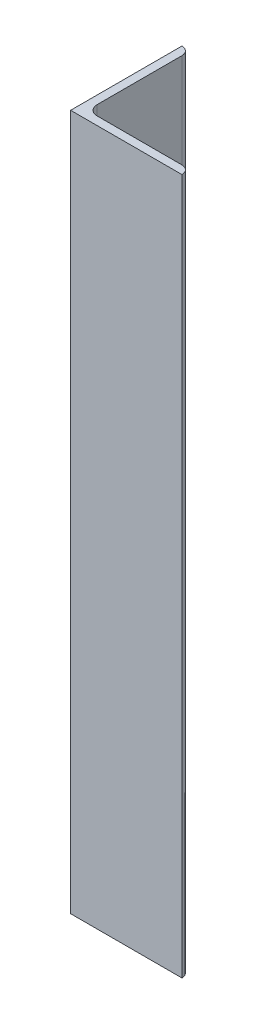
ISO-10303-21;
HEADER;
FILE_DESCRIPTION(('STEP AP214'),'2;1');
FILE_NAME('part.step','',(''),(''),'','','');
FILE_SCHEMA(('AUTOMOTIVE_DESIGN { 1 0 10303 214 1 1 1 1 }'));
ENDSEC;
DATA;
#1=APPLICATION_CONTEXT('core data for automotive mechanical design processes');
#2=APPLICATION_PROTOCOL_DEFINITION('international standard','automotive_design',2000,#1);
#3=PRODUCT_CONTEXT('',#1,'mechanical');
#4=PRODUCT('Part','Part','',(#3));
#5=PRODUCT_RELATED_PRODUCT_CATEGORY('part','',(#4));
#6=PRODUCT_DEFINITION_FORMATION('','',#4);
#7=PRODUCT_DEFINITION_CONTEXT('part definition',#1,'design');
#8=PRODUCT_DEFINITION('design','',#6,#7);
#9=PRODUCT_DEFINITION_SHAPE('','',#8);
#10=(LENGTH_UNIT() NAMED_UNIT(*) SI_UNIT(.MILLI.,.METRE.));
#11=(NAMED_UNIT(*) PLANE_ANGLE_UNIT() SI_UNIT($,.RADIAN.));
#12=(NAMED_UNIT(*) SI_UNIT($,.STERADIAN.) SOLID_ANGLE_UNIT());
#13=UNCERTAINTY_MEASURE_WITH_UNIT(LENGTH_MEASURE(1.E-05),#10,'distance_accuracy_value','');
#14=(GEOMETRIC_REPRESENTATION_CONTEXT(3) GLOBAL_UNCERTAINTY_ASSIGNED_CONTEXT((#13)) GLOBAL_UNIT_ASSIGNED_CONTEXT((#10,
#11,#12)) REPRESENTATION_CONTEXT('',''));
#15=CARTESIAN_POINT('',(0.,0.,0.));
#16=DIRECTION('',(0.,0.,1.));
#17=DIRECTION('',(1.,0.,0.));
#18=AXIS2_PLACEMENT_3D('',#15,#16,#17);
#19=CARTESIAN_POINT('',(40.,250.,0.));
#20=DIRECTION('',(0.,0.,-1.));
#21=DIRECTION('',(-1.,0.,0.));
#22=AXIS2_PLACEMENT_3D('',#19,#20,#21);
#23=PLANE('',#22);
#24=DIRECTION('',(1.,0.,0.));
#25=VECTOR('',#24,1.);
#26=CARTESIAN_POINT('',(40.,0.,0.));
#27=LINE('',#26,#25);
#28=CARTESIAN_POINT('',(0.,0.,0.));
#29=VERTEX_POINT('',#28);
#30=CARTESIAN_POINT('',(40.,0.,0.));
#31=VERTEX_POINT('',#30);
#32=EDGE_CURVE('E152',#29,#31,#27,.T.);
#33=ORIENTED_EDGE('',*,*,#32,.T.);
#34=DIRECTION('',(0.,-1.,0.));
#35=VECTOR('',#34,1.);
#36=CARTESIAN_POINT('',(40.,250.,0.));
#37=LINE('',#36,#35);
#38=CARTESIAN_POINT('',(40.,250.,0.));
#39=VERTEX_POINT('',#38);
#40=EDGE_CURVE('E13',#39,#31,#37,.T.);
#41=ORIENTED_EDGE('',*,*,#40,.F.);
#42=DIRECTION('',(1.,0.,0.));
#43=VECTOR('',#42,1.);
#44=CARTESIAN_POINT('',(40.,250.,0.));
#45=LINE('',#44,#43);
#46=CARTESIAN_POINT('',(0.,250.,0.));
#47=VERTEX_POINT('',#46);
#48=EDGE_CURVE('E164',#47,#39,#45,.T.);
#49=ORIENTED_EDGE('',*,*,#48,.F.);
#50=DIRECTION('',(0.,-1.,0.));
#51=VECTOR('',#50,1.);
#52=CARTESIAN_POINT('',(0.,250.,0.));
#53=LINE('',#52,#51);
#54=EDGE_CURVE('E148',#47,#29,#53,.T.);
#55=ORIENTED_EDGE('',*,*,#54,.T.);
#56=EDGE_LOOP('',(#33,#41,#49,#55));
#57=FACE_BOUND('',#56,.T.);
#58=ADVANCED_FACE('F62',(#57),#23,.F.);
#59=CARTESIAN_POINT('',(37.,250.,0.));
#60=DIRECTION('',(0.,-1.,0.));
#61=DIRECTION('',(0.,0.,-1.));
#62=AXIS2_PLACEMENT_3D('',#59,#60,#61);
#63=CYLINDRICAL_SURFACE('',#62,3.00000000000001);
#64=CARTESIAN_POINT('',(37.,0.,0.));
#65=DIRECTION('',(0.,1.,0.));
#66=DIRECTION('',(0.,0.,1.));
#67=AXIS2_PLACEMENT_3D('',#64,#65,#66);
#68=CIRCLE('',#67,3.00000000000001);
#69=CARTESIAN_POINT('',(37.,0.,-3.));
#70=VERTEX_POINT('',#69);
#71=EDGE_CURVE('E155',#31,#70,#68,.T.);
#72=ORIENTED_EDGE('',*,*,#71,.T.);
#73=DIRECTION('',(0.,-1.,0.));
#74=VECTOR('',#73,1.);
#75=CARTESIAN_POINT('',(37.,250.,-3.));
#76=LINE('',#75,#74);
#77=CARTESIAN_POINT('',(37.,250.,-3.));
#78=VERTEX_POINT('',#77);
#79=EDGE_CURVE('E70',#78,#70,#76,.T.);
#80=ORIENTED_EDGE('',*,*,#79,.F.);
#81=CARTESIAN_POINT('',(37.,250.,0.));
#82=DIRECTION('',(0.,1.,0.));
#83=DIRECTION('',(0.,0.,1.));
#84=AXIS2_PLACEMENT_3D('',#81,#82,#83);
#85=CIRCLE('',#84,3.00000000000001);
#86=EDGE_CURVE('E118',#39,#78,#85,.T.);
#87=ORIENTED_EDGE('',*,*,#86,.F.);
#88=ORIENTED_EDGE('',*,*,#40,.T.);
#89=EDGE_LOOP('',(#72,#80,#87,#88));
#90=FACE_BOUND('',#89,.T.);
#91=ADVANCED_FACE('F189',(#90),#63,.T.);
#92=CARTESIAN_POINT('',(6.5,250.,-3.));
#93=DIRECTION('',(0.,0.,1.));
#94=DIRECTION('',(1.,0.,0.));
#95=AXIS2_PLACEMENT_3D('',#92,#93,#94);
#96=PLANE('',#95);
#97=DIRECTION('',(-1.,0.,0.));
#98=VECTOR('',#97,1.);
#99=CARTESIAN_POINT('',(6.5,0.,-3.));
#100=LINE('',#99,#98);
#101=CARTESIAN_POINT('',(6.5,0.,-3.));
#102=VERTEX_POINT('',#101);
#103=EDGE_CURVE('E157',#70,#102,#100,.T.);
#104=ORIENTED_EDGE('',*,*,#103,.T.);
#105=DIRECTION('',(0.,-1.,0.));
#106=VECTOR('',#105,1.);
#107=CARTESIAN_POINT('',(6.5,250.,-3.));
#108=LINE('',#107,#106);
#109=CARTESIAN_POINT('',(6.5,250.,-3.));
#110=VERTEX_POINT('',#109);
#111=EDGE_CURVE('E168',#110,#102,#108,.T.);
#112=ORIENTED_EDGE('',*,*,#111,.F.);
#113=DIRECTION('',(-1.,0.,0.));
#114=VECTOR('',#113,1.);
#115=CARTESIAN_POINT('',(6.5,250.,-3.));
#116=LINE('',#115,#114);
#117=EDGE_CURVE('E176',#78,#110,#116,.T.);
#118=ORIENTED_EDGE('',*,*,#117,.F.);
#119=ORIENTED_EDGE('',*,*,#79,.T.);
#120=EDGE_LOOP('',(#104,#112,#118,#119));
#121=FACE_BOUND('',#120,.T.);
#122=ADVANCED_FACE('F174',(#121),#96,.F.);
#123=CARTESIAN_POINT('',(6.5,250.,-6.5));
#124=DIRECTION('',(0.,-1.,0.));
#125=DIRECTION('',(0.,0.,-1.));
#126=AXIS2_PLACEMENT_3D('',#123,#124,#125);
#127=CYLINDRICAL_SURFACE('',#126,3.5);
#128=CARTESIAN_POINT('',(6.5,0.,-6.5));
#129=DIRECTION('',(0.,-1.,0.));
#130=DIRECTION('',(0.,0.,-1.));
#131=AXIS2_PLACEMENT_3D('',#128,#129,#130);
#132=CIRCLE('',#131,3.5);
#133=CARTESIAN_POINT('',(3.,0.,-6.5));
#134=VERTEX_POINT('',#133);
#135=EDGE_CURVE('E159',#102,#134,#132,.T.);
#136=ORIENTED_EDGE('',*,*,#135,.T.);
#137=DIRECTION('',(0.,-1.,0.));
#138=VECTOR('',#137,1.);
#139=CARTESIAN_POINT('',(3.,250.,-6.5));
#140=LINE('',#139,#138);
#141=CARTESIAN_POINT('',(3.,250.,-6.5));
#142=VERTEX_POINT('',#141);
#143=EDGE_CURVE('E143',#142,#134,#140,.T.);
#144=ORIENTED_EDGE('',*,*,#143,.F.);
#145=CARTESIAN_POINT('',(6.5,250.,-6.5));
#146=DIRECTION('',(0.,-1.,0.));
#147=DIRECTION('',(0.,0.,-1.));
#148=AXIS2_PLACEMENT_3D('',#145,#146,#147);
#149=CIRCLE('',#148,3.5);
#150=EDGE_CURVE('E134',#110,#142,#149,.T.);
#151=ORIENTED_EDGE('',*,*,#150,.F.);
#152=ORIENTED_EDGE('',*,*,#111,.T.);
#153=EDGE_LOOP('',(#136,#144,#151,#152));
#154=FACE_BOUND('',#153,.T.);
#155=ADVANCED_FACE('F182',(#154),#127,.F.);
#156=CARTESIAN_POINT('',(3.,250.,-37.));
#157=DIRECTION('',(-1.,0.,0.));
#158=DIRECTION('',(0.,0.,1.));
#159=AXIS2_PLACEMENT_3D('',#156,#157,#158);
#160=PLANE('',#159);
#161=DIRECTION('',(0.,0.,-1.));
#162=VECTOR('',#161,1.);
#163=CARTESIAN_POINT('',(3.,0.,-37.));
#164=LINE('',#163,#162);
#165=CARTESIAN_POINT('',(3.,0.,-37.));
#166=VERTEX_POINT('',#165);
#167=EDGE_CURVE('E142',#134,#166,#164,.T.);
#168=ORIENTED_EDGE('',*,*,#167,.T.);
#169=DIRECTION('',(0.,-1.,0.));
#170=VECTOR('',#169,1.);
#171=CARTESIAN_POINT('',(3.,250.,-37.));
#172=LINE('',#171,#170);
#173=CARTESIAN_POINT('',(3.,250.,-37.));
#174=VERTEX_POINT('',#173);
#175=EDGE_CURVE('E139',#174,#166,#172,.T.);
#176=ORIENTED_EDGE('',*,*,#175,.F.);
#177=DIRECTION('',(0.,0.,-1.));
#178=VECTOR('',#177,1.);
#179=CARTESIAN_POINT('',(3.,250.,-37.));
#180=LINE('',#179,#178);
#181=EDGE_CURVE('E128',#142,#174,#180,.T.);
#182=ORIENTED_EDGE('',*,*,#181,.F.);
#183=ORIENTED_EDGE('',*,*,#143,.T.);
#184=EDGE_LOOP('',(#168,#176,#182,#183));
#185=FACE_BOUND('',#184,.T.);
#186=ADVANCED_FACE('F140',(#185),#160,.F.);
#187=CARTESIAN_POINT('',(0.,250.,-37.));
#188=DIRECTION('',(0.,-1.,0.));
#189=DIRECTION('',(0.,0.,-1.));
#190=AXIS2_PLACEMENT_3D('',#187,#188,#189);
#191=CYLINDRICAL_SURFACE('',#190,3.);
#192=CARTESIAN_POINT('',(0.,0.,-37.));
#193=DIRECTION('',(0.,1.,0.));
#194=DIRECTION('',(0.,0.,-1.));
#195=AXIS2_PLACEMENT_3D('',#192,#193,#194);
#196=CIRCLE('',#195,3.);
#197=CARTESIAN_POINT('',(0.,0.,-40.));
#198=VERTEX_POINT('',#197);
#199=EDGE_CURVE('E104',#166,#198,#196,.T.);
#200=ORIENTED_EDGE('',*,*,#199,.T.);
#201=DIRECTION('',(0.,-1.,0.));
#202=VECTOR('',#201,1.);
#203=CARTESIAN_POINT('',(0.,250.,-40.));
#204=LINE('',#203,#202);
#205=CARTESIAN_POINT('',(0.,250.,-40.));
#206=VERTEX_POINT('',#205);
#207=EDGE_CURVE('E144',#206,#198,#204,.T.);
#208=ORIENTED_EDGE('',*,*,#207,.F.);
#209=CARTESIAN_POINT('',(0.,250.,-37.));
#210=DIRECTION('',(0.,1.,0.));
#211=DIRECTION('',(0.,0.,-1.));
#212=AXIS2_PLACEMENT_3D('',#209,#210,#211);
#213=CIRCLE('',#212,3.);
#214=EDGE_CURVE('E132',#174,#206,#213,.T.);
#215=ORIENTED_EDGE('',*,*,#214,.F.);
#216=ORIENTED_EDGE('',*,*,#175,.T.);
#217=EDGE_LOOP('',(#200,#208,#215,#216));
#218=FACE_BOUND('',#217,.T.);
#219=ADVANCED_FACE('F146',(#218),#191,.T.);
#220=CARTESIAN_POINT('',(0.,250.,0.));
#221=DIRECTION('',(1.,0.,0.));
#222=DIRECTION('',(0.,0.,-1.));
#223=AXIS2_PLACEMENT_3D('',#220,#221,#222);
#224=PLANE('',#223);
#225=DIRECTION('',(0.,0.,1.));
#226=VECTOR('',#225,1.);
#227=CARTESIAN_POINT('',(0.,0.,0.));
#228=LINE('',#227,#226);
#229=EDGE_CURVE('E110',#198,#29,#228,.T.);
#230=ORIENTED_EDGE('',*,*,#229,.T.);
#231=ORIENTED_EDGE('',*,*,#54,.F.);
#232=DIRECTION('',(0.,0.,1.));
#233=VECTOR('',#232,1.);
#234=CARTESIAN_POINT('',(0.,250.,0.));
#235=LINE('',#234,#233);
#236=EDGE_CURVE('E78',#206,#47,#235,.T.);
#237=ORIENTED_EDGE('',*,*,#236,.F.);
#238=ORIENTED_EDGE('',*,*,#207,.T.);
#239=EDGE_LOOP('',(#230,#231,#237,#238));
#240=FACE_BOUND('',#239,.T.);
#241=ADVANCED_FACE('F203',(#240),#224,.F.);
#242=CARTESIAN_POINT('',(0.,250.,-37.));
#243=DIRECTION('',(0.,-1.,0.));
#244=DIRECTION('',(0.,0.,-1.));
#245=AXIS2_PLACEMENT_3D('',#242,#243,#244);
#246=PLANE('',#245);
#247=ORIENTED_EDGE('',*,*,#48,.T.);
#248=ORIENTED_EDGE('',*,*,#86,.T.);
#249=ORIENTED_EDGE('',*,*,#117,.T.);
#250=ORIENTED_EDGE('',*,*,#150,.T.);
#251=ORIENTED_EDGE('',*,*,#181,.T.);
#252=ORIENTED_EDGE('',*,*,#214,.T.);
#253=ORIENTED_EDGE('',*,*,#236,.T.);
#254=EDGE_LOOP('',(#247,#248,#249,#250,#251,#252,#253));
#255=FACE_BOUND('',#254,.T.);
#256=ADVANCED_FACE('F130',(#255),#246,.F.);
#257=CARTESIAN_POINT('',(0.,0.,-37.));
#258=DIRECTION('',(0.,-1.,0.));
#259=DIRECTION('',(0.,0.,-1.));
#260=AXIS2_PLACEMENT_3D('',#257,#258,#259);
#261=PLANE('',#260);
#262=ORIENTED_EDGE('',*,*,#32,.F.);
#263=ORIENTED_EDGE('',*,*,#229,.F.);
#264=ORIENTED_EDGE('',*,*,#199,.F.);
#265=ORIENTED_EDGE('',*,*,#167,.F.);
#266=ORIENTED_EDGE('',*,*,#135,.F.);
#267=ORIENTED_EDGE('',*,*,#103,.F.);
#268=ORIENTED_EDGE('',*,*,#71,.F.);
#269=EDGE_LOOP('',(#262,#263,#264,#265,#266,#267,#268));
#270=FACE_BOUND('',#269,.T.);
#271=ADVANCED_FACE('F180',(#270),#261,.T.);
#272=CLOSED_SHELL('',(#58,#91,#122,#155,#186,#219,#241,#256,#271));
#273=MANIFOLD_SOLID_BREP('B2',#272);
#274=ADVANCED_BREP_SHAPE_REPRESENTATION('',(#18,#273),#14);
#275=SHAPE_DEFINITION_REPRESENTATION(#9,#274);
ENDSEC;
END-ISO-10303-21;
